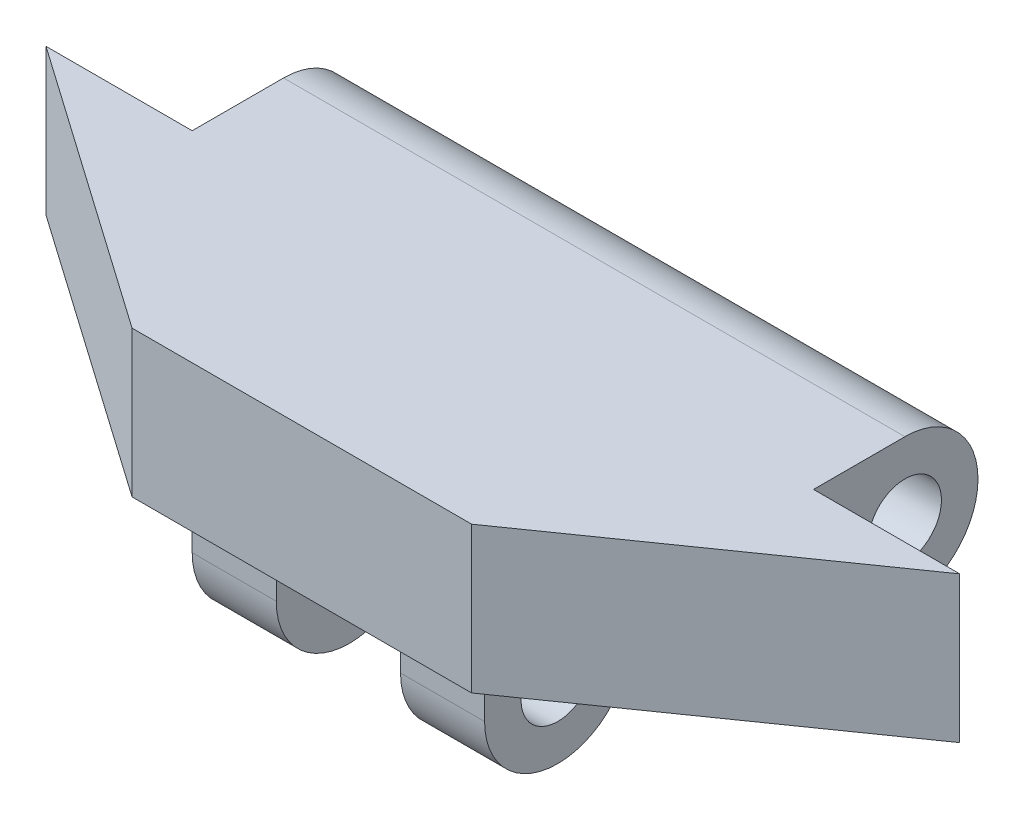
ISO-10303-21;
HEADER;
FILE_DESCRIPTION(('STEP AP214'),'2;1');
FILE_NAME('part.step','',(''),(''),'','','');
FILE_SCHEMA(('AUTOMOTIVE_DESIGN { 1 0 10303 214 1 1 1 1 }'));
ENDSEC;
DATA;
#1=APPLICATION_CONTEXT('core data for automotive mechanical design processes');
#2=APPLICATION_PROTOCOL_DEFINITION('international standard','automotive_design',2000,#1);
#3=PRODUCT_CONTEXT('',#1,'mechanical');
#4=PRODUCT('Part','Part','',(#3));
#5=PRODUCT_RELATED_PRODUCT_CATEGORY('part','',(#4));
#6=PRODUCT_DEFINITION_FORMATION('','',#4);
#7=PRODUCT_DEFINITION_CONTEXT('part definition',#1,'design');
#8=PRODUCT_DEFINITION('design','',#6,#7);
#9=PRODUCT_DEFINITION_SHAPE('','',#8);
#10=(LENGTH_UNIT() NAMED_UNIT(*) SI_UNIT(.MILLI.,.METRE.));
#11=(NAMED_UNIT(*) PLANE_ANGLE_UNIT() SI_UNIT($,.RADIAN.));
#12=(NAMED_UNIT(*) SI_UNIT($,.STERADIAN.) SOLID_ANGLE_UNIT());
#13=UNCERTAINTY_MEASURE_WITH_UNIT(LENGTH_MEASURE(1.E-05),#10,'distance_accuracy_value','');
#14=(GEOMETRIC_REPRESENTATION_CONTEXT(3) GLOBAL_UNCERTAINTY_ASSIGNED_CONTEXT((#13)) GLOBAL_UNIT_ASSIGNED_CONTEXT((#10,
#11,#12)) REPRESENTATION_CONTEXT('',''));
#15=CARTESIAN_POINT('',(0.,0.,0.));
#16=DIRECTION('',(0.,0.,1.));
#17=DIRECTION('',(1.,0.,0.));
#18=AXIS2_PLACEMENT_3D('',#15,#16,#17);
#19=CARTESIAN_POINT('',(0.,0.,0.));
#20=DIRECTION('',(0.,-1.,0.));
#21=DIRECTION('',(0.,0.,-1.));
#22=AXIS2_PLACEMENT_3D('',#19,#20,#21);
#23=PLANE('',#22);
#24=DIRECTION('',(-1.,0.,0.));
#25=VECTOR('',#24,1.);
#26=CARTESIAN_POINT('',(0.,0.,0.));
#27=LINE('',#26,#25);
#28=CARTESIAN_POINT('',(25.,0.,0.));
#29=VERTEX_POINT('',#28);
#30=CARTESIAN_POINT('',(21.,0.,0.));
#31=VERTEX_POINT('',#30);
#32=EDGE_CURVE('E236',#29,#31,#27,.T.);
#33=ORIENTED_EDGE('',*,*,#32,.F.);
#34=DIRECTION('',(0.819152044288991,0.,-0.573576436351046));
#35=VECTOR('',#34,1.);
#36=CARTESIAN_POINT('',(25.,0.,0.));
#37=LINE('',#36,#35);
#38=CARTESIAN_POINT('',(17.1451859629184,0.,5.5));
#39=VERTEX_POINT('',#38);
#40=EDGE_CURVE('E242',#39,#29,#37,.T.);
#41=ORIENTED_EDGE('',*,*,#40,.F.);
#42=DIRECTION('',(1.,0.,0.));
#43=VECTOR('',#42,1.);
#44=CARTESIAN_POINT('',(7.85481403708161,0.,5.5));
#45=LINE('',#44,#43);
#46=CARTESIAN_POINT('',(7.85481403708161,0.,5.5));
#47=VERTEX_POINT('',#46);
#48=EDGE_CURVE('E240',#47,#39,#45,.T.);
#49=ORIENTED_EDGE('',*,*,#48,.F.);
#50=DIRECTION('',(0.819152044288991,0.,0.573576436351047));
#51=VECTOR('',#50,1.);
#52=CARTESIAN_POINT('',(0.,0.,0.));
#53=LINE('',#52,#51);
#54=CARTESIAN_POINT('',(0.,0.,0.));
#55=VERTEX_POINT('',#54);
#56=EDGE_CURVE('E238',#55,#47,#53,.T.);
#57=ORIENTED_EDGE('',*,*,#56,.F.);
#58=CARTESIAN_POINT('',(4.,0.,0.));
#59=VERTEX_POINT('',#58);
#60=EDGE_CURVE('E224',#59,#55,#27,.T.);
#61=ORIENTED_EDGE('',*,*,#60,.F.);
#62=DIRECTION('',(0.,0.,-1.));
#63=VECTOR('',#62,1.);
#64=CARTESIAN_POINT('',(4.,0.,0.));
#65=LINE('',#64,#63);
#66=CARTESIAN_POINT('',(4.,0.,-2.5));
#67=VERTEX_POINT('',#66);
#68=EDGE_CURVE('E213',#59,#67,#65,.T.);
#69=ORIENTED_EDGE('',*,*,#68,.T.);
#70=DIRECTION('',(-1.,0.,0.));
#71=VECTOR('',#70,1.);
#72=CARTESIAN_POINT('',(21.,0.,-2.5));
#73=LINE('',#72,#71);
#74=CARTESIAN_POINT('',(21.,0.,-2.5));
#75=VERTEX_POINT('',#74);
#76=EDGE_CURVE('E221',#75,#67,#73,.T.);
#77=ORIENTED_EDGE('',*,*,#76,.F.);
#78=DIRECTION('',(0.,0.,-1.));
#79=VECTOR('',#78,1.);
#80=CARTESIAN_POINT('',(21.,0.,0.));
#81=LINE('',#80,#79);
#82=EDGE_CURVE('E203',#31,#75,#81,.T.);
#83=ORIENTED_EDGE('',*,*,#82,.F.);
#84=EDGE_LOOP('',(#33,#41,#49,#57,#61,#69,#77,#83));
#85=FACE_BOUND('',#84,.T.);
#86=DIRECTION('',(1.,0.,0.));
#87=VECTOR('',#86,1.);
#88=CARTESIAN_POINT('',(8.5,0.,0.5));
#89=LINE('',#88,#87);
#90=CARTESIAN_POINT('',(14.2,0.,0.5));
#91=VERTEX_POINT('',#90);
#92=CARTESIAN_POINT('',(16.5,0.,0.5));
#93=VERTEX_POINT('',#92);
#94=EDGE_CURVE('E167',#91,#93,#89,.T.);
#95=ORIENTED_EDGE('',*,*,#94,.F.);
#96=DIRECTION('',(1.,0.,0.));
#97=VECTOR('',#96,1.);
#98=CARTESIAN_POINT('',(6.67689437438234,0.,0.5));
#99=LINE('',#98,#97);
#100=CARTESIAN_POINT('',(10.8,0.,0.5));
#101=VERTEX_POINT('',#100);
#102=EDGE_CURVE('E155',#101,#91,#99,.T.);
#103=ORIENTED_EDGE('',*,*,#102,.F.);
#104=CARTESIAN_POINT('',(8.5,0.,0.5));
#105=VERTEX_POINT('',#104);
#106=EDGE_CURVE('E164',#105,#101,#89,.T.);
#107=ORIENTED_EDGE('',*,*,#106,.F.);
#108=DIRECTION('',(0.,0.,1.));
#109=VECTOR('',#108,1.);
#110=CARTESIAN_POINT('',(8.5,0.,4.5));
#111=LINE('',#110,#109);
#112=CARTESIAN_POINT('',(8.5,0.,4.5));
#113=VERTEX_POINT('',#112);
#114=EDGE_CURVE('E62',#105,#113,#111,.T.);
#115=ORIENTED_EDGE('',*,*,#114,.T.);
#116=DIRECTION('',(1.,0.,0.));
#117=VECTOR('',#116,1.);
#118=CARTESIAN_POINT('',(8.5,0.,4.5));
#119=LINE('',#118,#117);
#120=CARTESIAN_POINT('',(10.8,0.,4.5));
#121=VERTEX_POINT('',#120);
#122=EDGE_CURVE('E182',#113,#121,#119,.T.);
#123=ORIENTED_EDGE('',*,*,#122,.T.);
#124=DIRECTION('',(1.,0.,0.));
#125=VECTOR('',#124,1.);
#126=CARTESIAN_POINT('',(6.67689437438234,0.,4.5));
#127=LINE('',#126,#125);
#128=CARTESIAN_POINT('',(14.2,0.,4.5));
#129=VERTEX_POINT('',#128);
#130=EDGE_CURVE('E158',#121,#129,#127,.T.);
#131=ORIENTED_EDGE('',*,*,#130,.T.);
#132=CARTESIAN_POINT('',(16.5,0.,4.5));
#133=VERTEX_POINT('',#132);
#134=EDGE_CURVE('E180',#129,#133,#119,.T.);
#135=ORIENTED_EDGE('',*,*,#134,.T.);
#136=DIRECTION('',(0.,0.,1.));
#137=VECTOR('',#136,1.);
#138=CARTESIAN_POINT('',(16.5,0.,4.5));
#139=LINE('',#138,#137);
#140=EDGE_CURVE('E496',#93,#133,#139,.T.);
#141=ORIENTED_EDGE('',*,*,#140,.F.);
#142=EDGE_LOOP('',(#95,#103,#107,#115,#123,#131,#135,#141));
#143=FACE_BOUND('',#142,.T.);
#144=ADVANCED_FACE('F39',(#85,#143),#23,.T.);
#145=CARTESIAN_POINT('',(8.5,0.,4.5));
#146=DIRECTION('',(0.,0.,1.));
#147=DIRECTION('',(0.,-1.,0.));
#148=AXIS2_PLACEMENT_3D('',#145,#146,#147);
#149=PLANE('',#148);
#150=DIRECTION('',(0.,-1.,0.));
#151=VECTOR('',#150,1.);
#152=CARTESIAN_POINT('',(14.2,0.,4.5));
#153=LINE('',#152,#151);
#154=CARTESIAN_POINT('',(14.2,-1.5,4.5));
#155=VERTEX_POINT('',#154);
#156=EDGE_CURVE('E469',#129,#155,#153,.T.);
#157=ORIENTED_EDGE('',*,*,#156,.T.);
#158=DIRECTION('',(1.,0.,0.));
#159=VECTOR('',#158,1.);
#160=CARTESIAN_POINT('',(8.5,-1.5,4.5));
#161=LINE('',#160,#159);
#162=CARTESIAN_POINT('',(16.5,-1.5,4.5));
#163=VERTEX_POINT('',#162);
#164=EDGE_CURVE('E192',#155,#163,#161,.T.);
#165=ORIENTED_EDGE('',*,*,#164,.T.);
#166=DIRECTION('',(0.,-1.,0.));
#167=VECTOR('',#166,1.);
#168=CARTESIAN_POINT('',(16.5,0.,4.5));
#169=LINE('',#168,#167);
#170=EDGE_CURVE('E487',#133,#163,#169,.T.);
#171=ORIENTED_EDGE('',*,*,#170,.F.);
#172=ORIENTED_EDGE('',*,*,#134,.F.);
#173=EDGE_LOOP('',(#157,#165,#171,#172));
#174=FACE_BOUND('',#173,.T.);
#175=ADVANCED_FACE('F298',(#174),#149,.T.);
#176=CARTESIAN_POINT('',(8.5,0.,0.5));
#177=DIRECTION('',(0.,0.,-1.));
#178=DIRECTION('',(0.,1.,0.));
#179=AXIS2_PLACEMENT_3D('',#176,#177,#178);
#180=PLANE('',#179);
#181=DIRECTION('',(0.,1.,0.));
#182=VECTOR('',#181,1.);
#183=CARTESIAN_POINT('',(14.2,0.,0.5));
#184=LINE('',#183,#182);
#185=CARTESIAN_POINT('',(14.2,-1.5,0.5));
#186=VERTEX_POINT('',#185);
#187=EDGE_CURVE('E175',#186,#91,#184,.T.);
#188=ORIENTED_EDGE('',*,*,#187,.T.);
#189=ORIENTED_EDGE('',*,*,#94,.T.);
#190=DIRECTION('',(0.,1.,0.));
#191=VECTOR('',#190,1.);
#192=CARTESIAN_POINT('',(16.5,0.,0.5));
#193=LINE('',#192,#191);
#194=CARTESIAN_POINT('',(16.5,-1.5,0.5));
#195=VERTEX_POINT('',#194);
#196=EDGE_CURVE('E493',#195,#93,#193,.T.);
#197=ORIENTED_EDGE('',*,*,#196,.F.);
#198=DIRECTION('',(1.,0.,0.));
#199=VECTOR('',#198,1.);
#200=CARTESIAN_POINT('',(8.5,-1.5,0.5));
#201=LINE('',#200,#199);
#202=EDGE_CURVE('E188',#186,#195,#201,.T.);
#203=ORIENTED_EDGE('',*,*,#202,.F.);
#204=EDGE_LOOP('',(#188,#189,#197,#203));
#205=FACE_BOUND('',#204,.T.);
#206=ADVANCED_FACE('F304',(#205),#180,.T.);
#207=CARTESIAN_POINT('',(8.5,-1.5,2.5));
#208=DIRECTION('',(1.,0.,0.));
#209=DIRECTION('',(0.,0.,-1.));
#210=AXIS2_PLACEMENT_3D('',#207,#208,#209);
#211=CYLINDRICAL_SURFACE('',#210,2.);
#212=CARTESIAN_POINT('',(14.2,-1.5,2.5));
#213=DIRECTION('',(1.,0.,0.));
#214=DIRECTION('',(0.,1.,0.));
#215=AXIS2_PLACEMENT_3D('',#212,#213,#214);
#216=CIRCLE('',#215,2.);
#217=EDGE_CURVE('E475',#155,#186,#216,.T.);
#218=ORIENTED_EDGE('',*,*,#217,.T.);
#219=ORIENTED_EDGE('',*,*,#202,.T.);
#220=CARTESIAN_POINT('',(16.5,-1.5,2.5));
#221=DIRECTION('',(1.,0.,0.));
#222=DIRECTION('',(0.,0.,-1.));
#223=AXIS2_PLACEMENT_3D('',#220,#221,#222);
#224=CIRCLE('',#223,2.);
#225=EDGE_CURVE('E490',#163,#195,#224,.T.);
#226=ORIENTED_EDGE('',*,*,#225,.F.);
#227=ORIENTED_EDGE('',*,*,#164,.F.);
#228=EDGE_LOOP('',(#218,#219,#226,#227));
#229=FACE_BOUND('',#228,.T.);
#230=ADVANCED_FACE('F349',(#229),#211,.T.);
#231=CARTESIAN_POINT('',(8.5,-1.5,2.5));
#232=DIRECTION('',(1.,0.,0.));
#233=DIRECTION('',(0.,0.,-1.));
#234=AXIS2_PLACEMENT_3D('',#231,#232,#233);
#235=CYLINDRICAL_SURFACE('',#234,1.);
#236=CARTESIAN_POINT('',(14.2,-1.5,2.5));
#237=DIRECTION('',(1.,0.,0.));
#238=DIRECTION('',(0.,1.,0.));
#239=AXIS2_PLACEMENT_3D('',#236,#237,#238);
#240=CIRCLE('',#239,1.);
#241=CARTESIAN_POINT('',(14.2,-0.5,2.5));
#242=VERTEX_POINT('',#241);
#243=EDGE_CURVE('E476',#242,#242,#240,.T.);
#244=ORIENTED_EDGE('',*,*,#243,.F.);
#245=EDGE_LOOP('',(#244));
#246=FACE_BOUND('',#245,.T.);
#247=CARTESIAN_POINT('',(16.5,-1.5,2.5));
#248=DIRECTION('',(1.,0.,0.));
#249=DIRECTION('',(0.,0.,-1.));
#250=AXIS2_PLACEMENT_3D('',#247,#248,#249);
#251=CIRCLE('',#250,1.);
#252=CARTESIAN_POINT('',(16.5,-1.5,1.5));
#253=VERTEX_POINT('',#252);
#254=EDGE_CURVE('E479',#253,#253,#251,.T.);
#255=ORIENTED_EDGE('',*,*,#254,.T.);
#256=EDGE_LOOP('',(#255));
#257=FACE_BOUND('',#256,.T.);
#258=ADVANCED_FACE('F357',(#246,#257),#235,.F.);
#259=CARTESIAN_POINT('',(0.,4.,0.));
#260=DIRECTION('',(0.,0.,1.));
#261=DIRECTION('',(1.,0.,0.));
#262=AXIS2_PLACEMENT_3D('',#259,#260,#261);
#263=PLANE('',#262);
#264=DIRECTION('',(0.,-1.,0.));
#265=VECTOR('',#264,1.);
#266=CARTESIAN_POINT('',(21.,0.,0.));
#267=LINE('',#266,#265);
#268=CARTESIAN_POINT('',(21.,4.,0.));
#269=VERTEX_POINT('',#268);
#270=EDGE_CURVE('E200',#269,#31,#267,.T.);
#271=ORIENTED_EDGE('',*,*,#270,.F.);
#272=DIRECTION('',(-1.,0.,0.));
#273=VECTOR('',#272,1.);
#274=CARTESIAN_POINT('',(0.,4.,0.));
#275=LINE('',#274,#273);
#276=CARTESIAN_POINT('',(25.,4.,0.));
#277=VERTEX_POINT('',#276);
#278=EDGE_CURVE('E225',#277,#269,#275,.T.);
#279=ORIENTED_EDGE('',*,*,#278,.F.);
#280=DIRECTION('',(0.,-1.,0.));
#281=VECTOR('',#280,1.);
#282=CARTESIAN_POINT('',(25.,4.,0.));
#283=LINE('',#282,#281);
#284=EDGE_CURVE('E235',#277,#29,#283,.T.);
#285=ORIENTED_EDGE('',*,*,#284,.T.);
#286=ORIENTED_EDGE('',*,*,#32,.T.);
#287=EDGE_LOOP('',(#271,#279,#285,#286));
#288=FACE_BOUND('',#287,.T.);
#289=ADVANCED_FACE('F269',(#288),#263,.F.);
#290=CARTESIAN_POINT('',(4.,4.,0.));
#291=VERTEX_POINT('',#290);
#292=CARTESIAN_POINT('',(0.,4.,0.));
#293=VERTEX_POINT('',#292);
#294=EDGE_CURVE('E229',#291,#293,#275,.T.);
#295=ORIENTED_EDGE('',*,*,#294,.F.);
#296=DIRECTION('',(0.,-1.,0.));
#297=VECTOR('',#296,1.);
#298=CARTESIAN_POINT('',(4.,0.,0.));
#299=LINE('',#298,#297);
#300=EDGE_CURVE('E196',#291,#59,#299,.T.);
#301=ORIENTED_EDGE('',*,*,#300,.T.);
#302=ORIENTED_EDGE('',*,*,#60,.T.);
#303=DIRECTION('',(0.,-1.,0.));
#304=VECTOR('',#303,1.);
#305=CARTESIAN_POINT('',(0.,4.,0.));
#306=LINE('',#305,#304);
#307=EDGE_CURVE('E11',#293,#55,#306,.T.);
#308=ORIENTED_EDGE('',*,*,#307,.F.);
#309=EDGE_LOOP('',(#295,#301,#302,#308));
#310=FACE_BOUND('',#309,.T.);
#311=ADVANCED_FACE('F41',(#310),#263,.F.);
#312=CARTESIAN_POINT('',(0.,4.,0.));
#313=DIRECTION('',(0.573576436351047,0.,-0.819152044288991));
#314=DIRECTION('',(-0.819152044288991,0.,-0.573576436351047));
#315=AXIS2_PLACEMENT_3D('',#312,#313,#314);
#316=PLANE('',#315);
#317=ORIENTED_EDGE('',*,*,#56,.T.);
#318=DIRECTION('',(0.,-1.,0.));
#319=VECTOR('',#318,1.);
#320=CARTESIAN_POINT('',(7.85481403708161,4.,5.5));
#321=LINE('',#320,#319);
#322=CARTESIAN_POINT('',(7.85481403708161,4.,5.5));
#323=VERTEX_POINT('',#322);
#324=EDGE_CURVE('E47',#323,#47,#321,.T.);
#325=ORIENTED_EDGE('',*,*,#324,.F.);
#326=DIRECTION('',(0.819152044288991,0.,0.573576436351047));
#327=VECTOR('',#326,1.);
#328=CARTESIAN_POINT('',(0.,4.,0.));
#329=LINE('',#328,#327);
#330=EDGE_CURVE('E228',#293,#323,#329,.T.);
#331=ORIENTED_EDGE('',*,*,#330,.F.);
#332=ORIENTED_EDGE('',*,*,#307,.T.);
#333=EDGE_LOOP('',(#317,#325,#331,#332));
#334=FACE_BOUND('',#333,.T.);
#335=ADVANCED_FACE('F290',(#334),#316,.F.);
#336=CARTESIAN_POINT('',(7.85481403708161,4.,5.5));
#337=DIRECTION('',(0.,0.,-1.));
#338=DIRECTION('',(-1.,0.,0.));
#339=AXIS2_PLACEMENT_3D('',#336,#337,#338);
#340=PLANE('',#339);
#341=ORIENTED_EDGE('',*,*,#48,.T.);
#342=DIRECTION('',(0.,-1.,0.));
#343=VECTOR('',#342,1.);
#344=CARTESIAN_POINT('',(17.1451859629184,4.,5.5));
#345=LINE('',#344,#343);
#346=CARTESIAN_POINT('',(17.1451859629184,4.,5.5));
#347=VERTEX_POINT('',#346);
#348=EDGE_CURVE('E246',#347,#39,#345,.T.);
#349=ORIENTED_EDGE('',*,*,#348,.F.);
#350=DIRECTION('',(1.,0.,0.));
#351=VECTOR('',#350,1.);
#352=CARTESIAN_POINT('',(7.85481403708161,4.,5.5));
#353=LINE('',#352,#351);
#354=EDGE_CURVE('E231',#323,#347,#353,.T.);
#355=ORIENTED_EDGE('',*,*,#354,.F.);
#356=ORIENTED_EDGE('',*,*,#324,.T.);
#357=EDGE_LOOP('',(#341,#349,#355,#356));
#358=FACE_BOUND('',#357,.T.);
#359=ADVANCED_FACE('F253',(#358),#340,.F.);
#360=CARTESIAN_POINT('',(25.,4.,0.));
#361=DIRECTION('',(-0.573576436351047,0.,-0.819152044288992));
#362=DIRECTION('',(-0.819152044288992,0.,0.573576436351047));
#363=AXIS2_PLACEMENT_3D('',#360,#361,#362);
#364=PLANE('',#363);
#365=ORIENTED_EDGE('',*,*,#40,.T.);
#366=ORIENTED_EDGE('',*,*,#284,.F.);
#367=DIRECTION('',(0.819152044288991,0.,-0.573576436351046));
#368=VECTOR('',#367,1.);
#369=CARTESIAN_POINT('',(25.,4.,0.));
#370=LINE('',#369,#368);
#371=EDGE_CURVE('E233',#347,#277,#370,.T.);
#372=ORIENTED_EDGE('',*,*,#371,.F.);
#373=ORIENTED_EDGE('',*,*,#348,.T.);
#374=EDGE_LOOP('',(#365,#366,#372,#373));
#375=FACE_BOUND('',#374,.T.);
#376=ADVANCED_FACE('F265',(#375),#364,.F.);
#377=CARTESIAN_POINT('',(0.,4.,0.));
#378=DIRECTION('',(0.,-1.,0.));
#379=DIRECTION('',(0.,0.,-1.));
#380=AXIS2_PLACEMENT_3D('',#377,#378,#379);
#381=PLANE('',#380);
#382=ORIENTED_EDGE('',*,*,#278,.T.);
#383=DIRECTION('',(0.,0.,1.));
#384=VECTOR('',#383,1.);
#385=CARTESIAN_POINT('',(21.,4.,0.));
#386=LINE('',#385,#384);
#387=CARTESIAN_POINT('',(21.,4.,-2.5));
#388=VERTEX_POINT('',#387);
#389=EDGE_CURVE('E208',#388,#269,#386,.T.);
#390=ORIENTED_EDGE('',*,*,#389,.F.);
#391=DIRECTION('',(-1.,0.,0.));
#392=VECTOR('',#391,1.);
#393=CARTESIAN_POINT('',(21.,4.,-2.5));
#394=LINE('',#393,#392);
#395=CARTESIAN_POINT('',(4.,4.,-2.5));
#396=VERTEX_POINT('',#395);
#397=EDGE_CURVE('E211',#388,#396,#394,.T.);
#398=ORIENTED_EDGE('',*,*,#397,.T.);
#399=DIRECTION('',(0.,0.,1.));
#400=VECTOR('',#399,1.);
#401=CARTESIAN_POINT('',(4.,4.,0.));
#402=LINE('',#401,#400);
#403=EDGE_CURVE('E204',#396,#291,#402,.T.);
#404=ORIENTED_EDGE('',*,*,#403,.T.);
#405=ORIENTED_EDGE('',*,*,#294,.T.);
#406=ORIENTED_EDGE('',*,*,#330,.T.);
#407=ORIENTED_EDGE('',*,*,#354,.T.);
#408=ORIENTED_EDGE('',*,*,#371,.T.);
#409=EDGE_LOOP('',(#382,#390,#398,#404,#405,#406,#407,#408));
#410=FACE_BOUND('',#409,.T.);
#411=ADVANCED_FACE('F272',(#410),#381,.F.);
#412=CARTESIAN_POINT('',(21.,2.,-2.5));
#413=DIRECTION('',(1.,0.,0.));
#414=DIRECTION('',(0.,0.,-1.));
#415=AXIS2_PLACEMENT_3D('',#412,#413,#414);
#416=PLANE('',#415);
#417=ORIENTED_EDGE('',*,*,#270,.T.);
#418=ORIENTED_EDGE('',*,*,#82,.T.);
#419=CARTESIAN_POINT('',(21.,2.,-2.5));
#420=DIRECTION('',(1.,0.,0.));
#421=DIRECTION('',(0.,0.,-1.));
#422=AXIS2_PLACEMENT_3D('',#419,#420,#421);
#423=CIRCLE('',#422,2.);
#424=EDGE_CURVE('E206',#75,#388,#423,.T.);
#425=ORIENTED_EDGE('',*,*,#424,.T.);
#426=ORIENTED_EDGE('',*,*,#389,.T.);
#427=EDGE_LOOP('',(#417,#418,#425,#426));
#428=FACE_BOUND('',#427,.T.);
#429=CARTESIAN_POINT('',(21.,2.,-2.5));
#430=DIRECTION('',(1.,0.,0.));
#431=DIRECTION('',(0.,0.,-1.));
#432=AXIS2_PLACEMENT_3D('',#429,#430,#431);
#433=CIRCLE('',#432,1.);
#434=CARTESIAN_POINT('',(21.,2.,-3.5));
#435=VERTEX_POINT('',#434);
#436=EDGE_CURVE('E193',#435,#435,#433,.T.);
#437=ORIENTED_EDGE('',*,*,#436,.F.);
#438=EDGE_LOOP('',(#437));
#439=FACE_BOUND('',#438,.T.);
#440=ADVANCED_FACE('F274',(#428,#439),#416,.T.);
#441=CARTESIAN_POINT('',(4.,2.,-2.5));
#442=DIRECTION('',(1.,0.,0.));
#443=DIRECTION('',(0.,0.,-1.));
#444=AXIS2_PLACEMENT_3D('',#441,#442,#443);
#445=PLANE('',#444);
#446=ORIENTED_EDGE('',*,*,#300,.F.);
#447=ORIENTED_EDGE('',*,*,#403,.F.);
#448=CARTESIAN_POINT('',(4.,2.,-2.5));
#449=DIRECTION('',(1.,0.,0.));
#450=DIRECTION('',(0.,0.,-1.));
#451=AXIS2_PLACEMENT_3D('',#448,#449,#450);
#452=CIRCLE('',#451,2.);
#453=EDGE_CURVE('E215',#67,#396,#452,.T.);
#454=ORIENTED_EDGE('',*,*,#453,.F.);
#455=ORIENTED_EDGE('',*,*,#68,.F.);
#456=EDGE_LOOP('',(#446,#447,#454,#455));
#457=FACE_BOUND('',#456,.T.);
#458=CARTESIAN_POINT('',(4.,2.,-2.5));
#459=DIRECTION('',(1.,0.,0.));
#460=DIRECTION('',(0.,0.,-1.));
#461=AXIS2_PLACEMENT_3D('',#458,#459,#460);
#462=CIRCLE('',#461,1.);
#463=CARTESIAN_POINT('',(4.,2.,-3.5));
#464=VERTEX_POINT('',#463);
#465=EDGE_CURVE('E197',#464,#464,#462,.T.);
#466=ORIENTED_EDGE('',*,*,#465,.T.);
#467=EDGE_LOOP('',(#466));
#468=FACE_BOUND('',#467,.T.);
#469=ADVANCED_FACE('F285',(#457,#468),#445,.F.);
#470=CARTESIAN_POINT('',(21.,2.,-2.5));
#471=DIRECTION('',(-1.,0.,0.));
#472=DIRECTION('',(0.,0.,1.));
#473=AXIS2_PLACEMENT_3D('',#470,#471,#472);
#474=CYLINDRICAL_SURFACE('',#473,2.);
#475=ORIENTED_EDGE('',*,*,#453,.T.);
#476=ORIENTED_EDGE('',*,*,#397,.F.);
#477=ORIENTED_EDGE('',*,*,#424,.F.);
#478=ORIENTED_EDGE('',*,*,#76,.T.);
#479=EDGE_LOOP('',(#475,#476,#477,#478));
#480=FACE_BOUND('',#479,.T.);
#481=ADVANCED_FACE('F280',(#480),#474,.T.);
#482=CARTESIAN_POINT('',(21.,2.,-2.5));
#483=DIRECTION('',(-1.,0.,0.));
#484=DIRECTION('',(0.,0.,1.));
#485=AXIS2_PLACEMENT_3D('',#482,#483,#484);
#486=CYLINDRICAL_SURFACE('',#485,1.);
#487=ORIENTED_EDGE('',*,*,#436,.T.);
#488=EDGE_LOOP('',(#487));
#489=FACE_BOUND('',#488,.T.);
#490=ORIENTED_EDGE('',*,*,#465,.F.);
#491=EDGE_LOOP('',(#490));
#492=FACE_BOUND('',#491,.T.);
#493=ADVANCED_FACE('F325',(#489,#492),#486,.F.);
#494=DIRECTION('',(0.,1.,0.));
#495=VECTOR('',#494,1.);
#496=CARTESIAN_POINT('',(10.8,0.,4.5));
#497=LINE('',#496,#495);
#498=CARTESIAN_POINT('',(10.8,-1.5,4.5));
#499=VERTEX_POINT('',#498);
#500=EDGE_CURVE('E54',#499,#121,#497,.T.);
#501=ORIENTED_EDGE('',*,*,#500,.T.);
#502=ORIENTED_EDGE('',*,*,#122,.F.);
#503=DIRECTION('',(0.,-1.,0.));
#504=VECTOR('',#503,1.);
#505=CARTESIAN_POINT('',(8.5,0.,4.5));
#506=LINE('',#505,#504);
#507=CARTESIAN_POINT('',(8.5,-1.5,4.5));
#508=VERTEX_POINT('',#507);
#509=EDGE_CURVE('E502',#113,#508,#506,.T.);
#510=ORIENTED_EDGE('',*,*,#509,.T.);
#511=EDGE_CURVE('E189',#508,#499,#161,.T.);
#512=ORIENTED_EDGE('',*,*,#511,.T.);
#513=EDGE_LOOP('',(#501,#502,#510,#512));
#514=FACE_BOUND('',#513,.T.);
#515=ADVANCED_FACE('F307',(#514),#149,.T.);
#516=DIRECTION('',(0.,-1.,0.));
#517=VECTOR('',#516,1.);
#518=CARTESIAN_POINT('',(10.8,0.,0.5));
#519=LINE('',#518,#517);
#520=CARTESIAN_POINT('',(10.8,-1.5,0.5));
#521=VERTEX_POINT('',#520);
#522=EDGE_CURVE('E160',#101,#521,#519,.T.);
#523=ORIENTED_EDGE('',*,*,#522,.T.);
#524=CARTESIAN_POINT('',(8.5,-1.5,0.5));
#525=VERTEX_POINT('',#524);
#526=EDGE_CURVE('E184',#525,#521,#201,.T.);
#527=ORIENTED_EDGE('',*,*,#526,.F.);
#528=DIRECTION('',(0.,1.,0.));
#529=VECTOR('',#528,1.);
#530=CARTESIAN_POINT('',(8.5,0.,0.5));
#531=LINE('',#530,#529);
#532=EDGE_CURVE('E179',#525,#105,#531,.T.);
#533=ORIENTED_EDGE('',*,*,#532,.T.);
#534=ORIENTED_EDGE('',*,*,#106,.T.);
#535=EDGE_LOOP('',(#523,#527,#533,#534));
#536=FACE_BOUND('',#535,.T.);
#537=ADVANCED_FACE('F177',(#536),#180,.T.);
#538=CARTESIAN_POINT('',(10.8,-1.5,2.5));
#539=DIRECTION('',(-1.,0.,0.));
#540=DIRECTION('',(0.,0.,1.));
#541=AXIS2_PLACEMENT_3D('',#538,#539,#540);
#542=CIRCLE('',#541,2.);
#543=EDGE_CURVE('E172',#521,#499,#542,.T.);
#544=ORIENTED_EDGE('',*,*,#543,.T.);
#545=ORIENTED_EDGE('',*,*,#511,.F.);
#546=CARTESIAN_POINT('',(8.5,-1.5,2.5));
#547=DIRECTION('',(1.,0.,0.));
#548=DIRECTION('',(0.,0.,-1.));
#549=AXIS2_PLACEMENT_3D('',#546,#547,#548);
#550=CIRCLE('',#549,2.);
#551=EDGE_CURVE('E505',#508,#525,#550,.T.);
#552=ORIENTED_EDGE('',*,*,#551,.T.);
#553=ORIENTED_EDGE('',*,*,#526,.T.);
#554=EDGE_LOOP('',(#544,#545,#552,#553));
#555=FACE_BOUND('',#554,.T.);
#556=ADVANCED_FACE('F343',(#555),#211,.T.);
#557=CARTESIAN_POINT('',(8.5,-1.5,2.5));
#558=DIRECTION('',(1.,0.,0.));
#559=DIRECTION('',(0.,0.,-1.));
#560=AXIS2_PLACEMENT_3D('',#557,#558,#559);
#561=PLANE('',#560);
#562=CARTESIAN_POINT('',(8.5,-1.5,2.5));
#563=DIRECTION('',(1.,0.,0.));
#564=DIRECTION('',(0.,0.,-1.));
#565=AXIS2_PLACEMENT_3D('',#562,#563,#564);
#566=CIRCLE('',#565,1.);
#567=CARTESIAN_POINT('',(8.5,-1.5,1.5));
#568=VERTEX_POINT('',#567);
#569=EDGE_CURVE('E499',#568,#568,#566,.T.);
#570=ORIENTED_EDGE('',*,*,#569,.T.);
#571=EDGE_LOOP('',(#570));
#572=FACE_BOUND('',#571,.T.);
#573=ORIENTED_EDGE('',*,*,#509,.F.);
#574=ORIENTED_EDGE('',*,*,#114,.F.);
#575=ORIENTED_EDGE('',*,*,#532,.F.);
#576=ORIENTED_EDGE('',*,*,#551,.F.);
#577=EDGE_LOOP('',(#573,#574,#575,#576));
#578=FACE_BOUND('',#577,.T.);
#579=ADVANCED_FACE('F347',(#572,#578),#561,.F.);
#580=CARTESIAN_POINT('',(10.8,-1.5,2.5));
#581=DIRECTION('',(-1.,0.,0.));
#582=DIRECTION('',(0.,0.,1.));
#583=AXIS2_PLACEMENT_3D('',#580,#581,#582);
#584=CIRCLE('',#583,1.);
#585=CARTESIAN_POINT('',(10.8,-1.5,3.5));
#586=VERTEX_POINT('',#585);
#587=EDGE_CURVE('E481',#586,#586,#584,.T.);
#588=ORIENTED_EDGE('',*,*,#587,.F.);
#589=EDGE_LOOP('',(#588));
#590=FACE_BOUND('',#589,.T.);
#591=ORIENTED_EDGE('',*,*,#569,.F.);
#592=EDGE_LOOP('',(#591));
#593=FACE_BOUND('',#592,.T.);
#594=ADVANCED_FACE('F352',(#590,#593),#235,.F.);
#595=CARTESIAN_POINT('',(16.5,-1.5,2.5));
#596=DIRECTION('',(1.,0.,0.));
#597=DIRECTION('',(0.,0.,-1.));
#598=AXIS2_PLACEMENT_3D('',#595,#596,#597);
#599=PLANE('',#598);
#600=ORIENTED_EDGE('',*,*,#170,.T.);
#601=ORIENTED_EDGE('',*,*,#225,.T.);
#602=ORIENTED_EDGE('',*,*,#196,.T.);
#603=ORIENTED_EDGE('',*,*,#140,.T.);
#604=EDGE_LOOP('',(#600,#601,#602,#603));
#605=FACE_BOUND('',#604,.T.);
#606=ORIENTED_EDGE('',*,*,#254,.F.);
#607=EDGE_LOOP('',(#606));
#608=FACE_BOUND('',#607,.T.);
#609=ADVANCED_FACE('F355',(#605,#608),#599,.T.);
#610=CARTESIAN_POINT('',(14.2,0.,-4.501));
#611=DIRECTION('',(1.,0.,0.));
#612=DIRECTION('',(0.,1.,0.));
#613=AXIS2_PLACEMENT_3D('',#610,#611,#612);
#614=PLANE('',#613);
#615=ORIENTED_EDGE('',*,*,#243,.T.);
#616=EDGE_LOOP('',(#615));
#617=FACE_BOUND('',#616,.T.);
#618=ORIENTED_EDGE('',*,*,#156,.F.);
#619=CARTESIAN_POINT('',(14.2,-1.5,2.5));
#620=DIRECTION('',(-1.,0.,0.));
#621=DIRECTION('',(0.,-1.,0.));
#622=AXIS2_PLACEMENT_3D('',#619,#620,#621);
#623=CIRCLE('',#622,2.5);
#624=EDGE_CURVE('E168',#129,#91,#623,.T.);
#625=ORIENTED_EDGE('',*,*,#624,.T.);
#626=ORIENTED_EDGE('',*,*,#187,.F.);
#627=ORIENTED_EDGE('',*,*,#217,.F.);
#628=EDGE_LOOP('',(#618,#625,#626,#627));
#629=FACE_BOUND('',#628,.T.);
#630=ADVANCED_FACE('F360',(#617,#629),#614,.F.);
#631=CARTESIAN_POINT('',(10.8,0.,-4.501));
#632=DIRECTION('',(-1.,0.,0.));
#633=DIRECTION('',(0.,0.,1.));
#634=AXIS2_PLACEMENT_3D('',#631,#632,#633);
#635=PLANE('',#634);
#636=ORIENTED_EDGE('',*,*,#587,.T.);
#637=EDGE_LOOP('',(#636));
#638=FACE_BOUND('',#637,.T.);
#639=ORIENTED_EDGE('',*,*,#543,.F.);
#640=ORIENTED_EDGE('',*,*,#522,.F.);
#641=CARTESIAN_POINT('',(10.8,-1.5,2.5));
#642=DIRECTION('',(-1.,0.,0.));
#643=DIRECTION('',(0.,0.,1.));
#644=AXIS2_PLACEMENT_3D('',#641,#642,#643);
#645=CIRCLE('',#644,2.5);
#646=EDGE_CURVE('E152',#121,#101,#645,.T.);
#647=ORIENTED_EDGE('',*,*,#646,.F.);
#648=ORIENTED_EDGE('',*,*,#500,.F.);
#649=EDGE_LOOP('',(#639,#640,#647,#648));
#650=FACE_BOUND('',#649,.T.);
#651=ADVANCED_FACE('F171',(#638,#650),#635,.F.);
#652=CARTESIAN_POINT('',(6.67689437438234,-1.5,2.5));
#653=DIRECTION('',(1.,0.,0.));
#654=DIRECTION('',(0.,1.,0.));
#655=AXIS2_PLACEMENT_3D('',#652,#653,#654);
#656=CYLINDRICAL_SURFACE('',#655,2.5);
#657=ORIENTED_EDGE('',*,*,#646,.T.);
#658=ORIENTED_EDGE('',*,*,#102,.T.);
#659=ORIENTED_EDGE('',*,*,#624,.F.);
#660=ORIENTED_EDGE('',*,*,#130,.F.);
#661=EDGE_LOOP('',(#657,#658,#659,#660));
#662=FACE_BOUND('',#661,.T.);
#663=ADVANCED_FACE('F154',(#662),#656,.F.);
#664=CLOSED_SHELL('',(#144,#175,#206,#230,#258,#289,#311,#335,#359,#376,#411,#440,#469,#481,
#493,#515,#537,#556,#579,#594,#609,#630,#651,#663));
#665=MANIFOLD_SOLID_BREP('B2',#664);
#666=ADVANCED_BREP_SHAPE_REPRESENTATION('',(#18,#665),#14);
#667=SHAPE_DEFINITION_REPRESENTATION(#9,#666);
ENDSEC;
END-ISO-10303-21;
